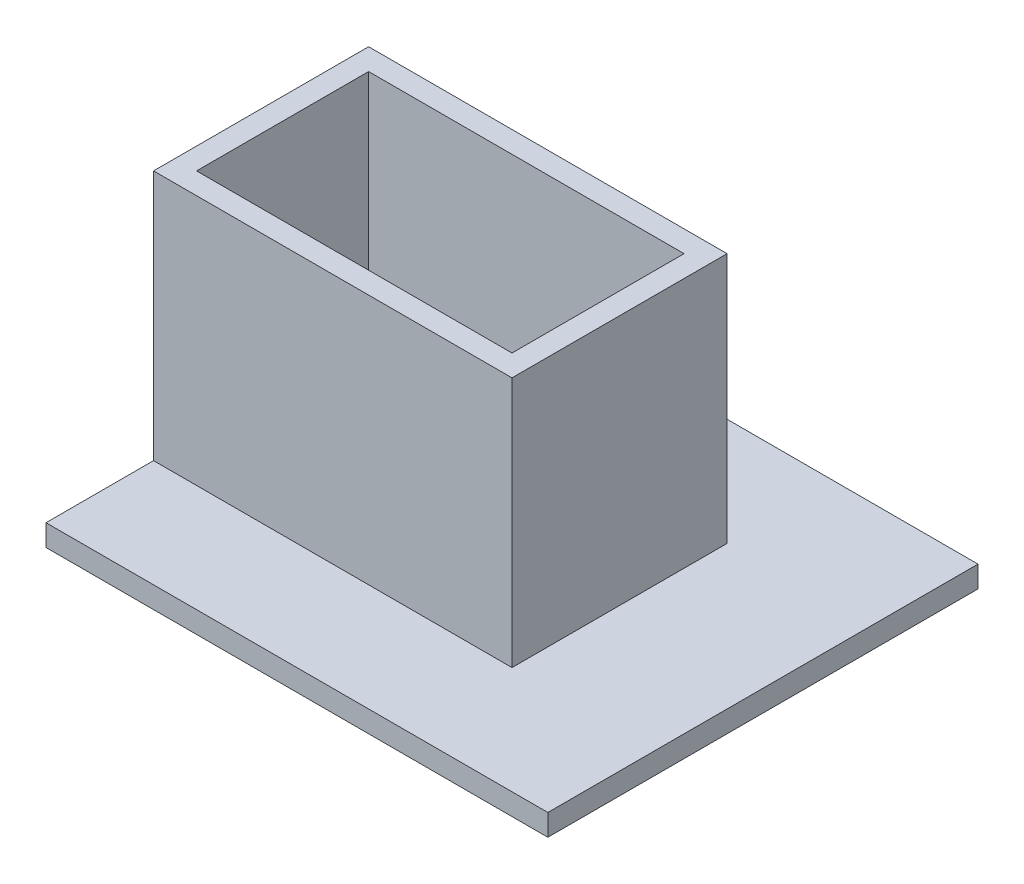
ISO-10303-21;
HEADER;
FILE_DESCRIPTION(('STEP AP214'),'2;1');
FILE_NAME('part.step','',(''),(''),'','','');
FILE_SCHEMA(('AUTOMOTIVE_DESIGN { 1 0 10303 214 1 1 1 1 }'));
ENDSEC;
DATA;
#1=APPLICATION_CONTEXT('core data for automotive mechanical design processes');
#2=APPLICATION_PROTOCOL_DEFINITION('international standard','automotive_design',2000,#1);
#3=PRODUCT_CONTEXT('',#1,'mechanical');
#4=PRODUCT('Part','Part','',(#3));
#5=PRODUCT_RELATED_PRODUCT_CATEGORY('part','',(#4));
#6=PRODUCT_DEFINITION_FORMATION('','',#4);
#7=PRODUCT_DEFINITION_CONTEXT('part definition',#1,'design');
#8=PRODUCT_DEFINITION('design','',#6,#7);
#9=PRODUCT_DEFINITION_SHAPE('','',#8);
#10=(LENGTH_UNIT() NAMED_UNIT(*) SI_UNIT(.MILLI.,.METRE.));
#11=(NAMED_UNIT(*) PLANE_ANGLE_UNIT() SI_UNIT($,.RADIAN.));
#12=(NAMED_UNIT(*) SI_UNIT($,.STERADIAN.) SOLID_ANGLE_UNIT());
#13=UNCERTAINTY_MEASURE_WITH_UNIT(LENGTH_MEASURE(1.E-05),#10,'distance_accuracy_value','');
#14=(GEOMETRIC_REPRESENTATION_CONTEXT(3) GLOBAL_UNCERTAINTY_ASSIGNED_CONTEXT((#13)) GLOBAL_UNIT_ASSIGNED_CONTEXT((#10,
#11,#12)) REPRESENTATION_CONTEXT('',''));
#15=CARTESIAN_POINT('',(0.,0.,0.));
#16=DIRECTION('',(0.,0.,1.));
#17=DIRECTION('',(1.,0.,0.));
#18=AXIS2_PLACEMENT_3D('',#15,#16,#17);
#19=CARTESIAN_POINT('',(0.,0.,0.));
#20=DIRECTION('',(0.,-1.,0.));
#21=DIRECTION('',(0.,0.,-1.));
#22=AXIS2_PLACEMENT_3D('',#19,#20,#21);
#23=PLANE('',#22);
#24=DIRECTION('',(0.,0.,1.));
#25=VECTOR('',#24,1.);
#26=CARTESIAN_POINT('',(-22.,0.,-12.));
#27=LINE('',#26,#25);
#28=CARTESIAN_POINT('',(-22.,0.,-12.));
#29=VERTEX_POINT('',#28);
#30=CARTESIAN_POINT('',(-22.,0.,12.));
#31=VERTEX_POINT('',#30);
#32=EDGE_CURVE('E140',#29,#31,#27,.T.);
#33=ORIENTED_EDGE('',*,*,#32,.T.);
#34=DIRECTION('',(1.,0.,0.));
#35=VECTOR('',#34,1.);
#36=CARTESIAN_POINT('',(-22.,0.,12.));
#37=LINE('',#36,#35);
#38=CARTESIAN_POINT('',(22.,0.,12.));
#39=VERTEX_POINT('',#38);
#40=EDGE_CURVE('E163',#31,#39,#37,.T.);
#41=ORIENTED_EDGE('',*,*,#40,.T.);
#42=DIRECTION('',(0.,0.,-1.));
#43=VECTOR('',#42,1.);
#44=CARTESIAN_POINT('',(22.,0.,12.));
#45=LINE('',#44,#43);
#46=CARTESIAN_POINT('',(22.,0.,-12.));
#47=VERTEX_POINT('',#46);
#48=EDGE_CURVE('E146',#39,#47,#45,.T.);
#49=ORIENTED_EDGE('',*,*,#48,.T.);
#50=DIRECTION('',(-1.,0.,0.));
#51=VECTOR('',#50,1.);
#52=CARTESIAN_POINT('',(22.,0.,-12.));
#53=LINE('',#52,#51);
#54=EDGE_CURVE('E168',#47,#29,#53,.T.);
#55=ORIENTED_EDGE('',*,*,#54,.T.);
#56=EDGE_LOOP('',(#33,#41,#49,#55));
#57=FACE_BOUND('',#56,.T.);
#58=ADVANCED_FACE('F39',(#57),#23,.F.);
#59=CARTESIAN_POINT('',(0.,35.,0.));
#60=DIRECTION('',(0.,1.,0.));
#61=DIRECTION('',(0.,0.,1.));
#62=AXIS2_PLACEMENT_3D('',#59,#60,#61);
#63=PLANE('',#62);
#64=DIRECTION('',(0.,0.,-1.));
#65=VECTOR('',#64,1.);
#66=CARTESIAN_POINT('',(25.,35.,15.));
#67=LINE('',#66,#65);
#68=CARTESIAN_POINT('',(25.,35.,15.));
#69=VERTEX_POINT('',#68);
#70=CARTESIAN_POINT('',(25.,35.,-15.));
#71=VERTEX_POINT('',#70);
#72=EDGE_CURVE('E182',#69,#71,#67,.T.);
#73=ORIENTED_EDGE('',*,*,#72,.T.);
#74=DIRECTION('',(-1.,0.,0.));
#75=VECTOR('',#74,1.);
#76=CARTESIAN_POINT('',(25.,35.,-15.));
#77=LINE('',#76,#75);
#78=CARTESIAN_POINT('',(-25.,35.,-15.));
#79=VERTEX_POINT('',#78);
#80=EDGE_CURVE('E186',#71,#79,#77,.T.);
#81=ORIENTED_EDGE('',*,*,#80,.T.);
#82=DIRECTION('',(0.,0.,1.));
#83=VECTOR('',#82,1.);
#84=CARTESIAN_POINT('',(-25.,35.,-15.));
#85=LINE('',#84,#83);
#86=CARTESIAN_POINT('',(-25.,35.,15.));
#87=VERTEX_POINT('',#86);
#88=EDGE_CURVE('E190',#79,#87,#85,.T.);
#89=ORIENTED_EDGE('',*,*,#88,.T.);
#90=DIRECTION('',(1.,0.,0.));
#91=VECTOR('',#90,1.);
#92=CARTESIAN_POINT('',(-25.,35.,15.));
#93=LINE('',#92,#91);
#94=EDGE_CURVE('E193',#87,#69,#93,.T.);
#95=ORIENTED_EDGE('',*,*,#94,.T.);
#96=EDGE_LOOP('',(#73,#81,#89,#95));
#97=FACE_BOUND('',#96,.T.);
#98=DIRECTION('',(0.,0.,-1.));
#99=VECTOR('',#98,1.);
#100=CARTESIAN_POINT('',(22.,35.,12.));
#101=LINE('',#100,#99);
#102=CARTESIAN_POINT('',(22.,35.,12.));
#103=VERTEX_POINT('',#102);
#104=CARTESIAN_POINT('',(22.,35.,-12.));
#105=VERTEX_POINT('',#104);
#106=EDGE_CURVE('E139',#103,#105,#101,.T.);
#107=ORIENTED_EDGE('',*,*,#106,.F.);
#108=DIRECTION('',(1.,0.,0.));
#109=VECTOR('',#108,1.);
#110=CARTESIAN_POINT('',(-22.,35.,12.));
#111=LINE('',#110,#109);
#112=CARTESIAN_POINT('',(-22.,35.,12.));
#113=VERTEX_POINT('',#112);
#114=EDGE_CURVE('E130',#113,#103,#111,.T.);
#115=ORIENTED_EDGE('',*,*,#114,.F.);
#116=DIRECTION('',(0.,0.,1.));
#117=VECTOR('',#116,1.);
#118=CARTESIAN_POINT('',(-22.,35.,-12.));
#119=LINE('',#118,#117);
#120=CARTESIAN_POINT('',(-22.,35.,-12.));
#121=VERTEX_POINT('',#120);
#122=EDGE_CURVE('E158',#121,#113,#119,.T.);
#123=ORIENTED_EDGE('',*,*,#122,.F.);
#124=DIRECTION('',(-1.,0.,0.));
#125=VECTOR('',#124,1.);
#126=CARTESIAN_POINT('',(22.,35.,-12.));
#127=LINE('',#126,#125);
#128=EDGE_CURVE('E154',#105,#121,#127,.T.);
#129=ORIENTED_EDGE('',*,*,#128,.F.);
#130=EDGE_LOOP('',(#107,#115,#123,#129));
#131=FACE_BOUND('',#130,.T.);
#132=ADVANCED_FACE('F152',(#97,#131),#63,.T.);
#133=CARTESIAN_POINT('',(25.,35.,15.));
#134=DIRECTION('',(-1.,0.,0.));
#135=DIRECTION('',(0.,0.,1.));
#136=AXIS2_PLACEMENT_3D('',#133,#134,#135);
#137=PLANE('',#136);
#138=DIRECTION('',(0.,0.,-1.));
#139=VECTOR('',#138,1.);
#140=CARTESIAN_POINT('',(25.,0.,15.));
#141=LINE('',#140,#139);
#142=CARTESIAN_POINT('',(25.,0.,15.));
#143=VERTEX_POINT('',#142);
#144=CARTESIAN_POINT('',(25.,0.,-15.));
#145=VERTEX_POINT('',#144);
#146=EDGE_CURVE('E148',#143,#145,#141,.T.);
#147=ORIENTED_EDGE('',*,*,#146,.T.);
#148=DIRECTION('',(0.,-1.,0.));
#149=VECTOR('',#148,1.);
#150=CARTESIAN_POINT('',(25.,35.,-15.));
#151=LINE('',#150,#149);
#152=EDGE_CURVE('E216',#71,#145,#151,.T.);
#153=ORIENTED_EDGE('',*,*,#152,.F.);
#154=ORIENTED_EDGE('',*,*,#72,.F.);
#155=DIRECTION('',(0.,-1.,0.));
#156=VECTOR('',#155,1.);
#157=CARTESIAN_POINT('',(25.,35.,15.));
#158=LINE('',#157,#156);
#159=EDGE_CURVE('E196',#69,#143,#158,.T.);
#160=ORIENTED_EDGE('',*,*,#159,.T.);
#161=EDGE_LOOP('',(#147,#153,#154,#160));
#162=FACE_BOUND('',#161,.T.);
#163=ADVANCED_FACE('F272',(#162),#137,.F.);
#164=CARTESIAN_POINT('',(25.,35.,-15.));
#165=DIRECTION('',(0.,0.,1.));
#166=DIRECTION('',(1.,0.,0.));
#167=AXIS2_PLACEMENT_3D('',#164,#165,#166);
#168=PLANE('',#167);
#169=DIRECTION('',(-1.,0.,0.));
#170=VECTOR('',#169,1.);
#171=CARTESIAN_POINT('',(25.,0.,-15.));
#172=LINE('',#171,#170);
#173=CARTESIAN_POINT('',(-25.,0.,-15.));
#174=VERTEX_POINT('',#173);
#175=EDGE_CURVE('E55',#145,#174,#172,.T.);
#176=ORIENTED_EDGE('',*,*,#175,.T.);
#177=DIRECTION('',(0.,-1.,0.));
#178=VECTOR('',#177,1.);
#179=CARTESIAN_POINT('',(-25.,35.,-15.));
#180=LINE('',#179,#178);
#181=EDGE_CURVE('E212',#79,#174,#180,.T.);
#182=ORIENTED_EDGE('',*,*,#181,.F.);
#183=ORIENTED_EDGE('',*,*,#80,.F.);
#184=ORIENTED_EDGE('',*,*,#152,.T.);
#185=EDGE_LOOP('',(#176,#182,#183,#184));
#186=FACE_BOUND('',#185,.T.);
#187=ADVANCED_FACE('F278',(#186),#168,.F.);
#188=CARTESIAN_POINT('',(-25.,35.,15.));
#189=DIRECTION('',(0.,0.,-1.));
#190=DIRECTION('',(-1.,0.,0.));
#191=AXIS2_PLACEMENT_3D('',#188,#189,#190);
#192=PLANE('',#191);
#193=DIRECTION('',(1.,0.,0.));
#194=VECTOR('',#193,1.);
#195=CARTESIAN_POINT('',(-25.,0.,15.));
#196=LINE('',#195,#194);
#197=CARTESIAN_POINT('',(-25.,0.,15.));
#198=VERTEX_POINT('',#197);
#199=EDGE_CURVE('E187',#198,#143,#196,.T.);
#200=ORIENTED_EDGE('',*,*,#199,.T.);
#201=ORIENTED_EDGE('',*,*,#159,.F.);
#202=ORIENTED_EDGE('',*,*,#94,.F.);
#203=DIRECTION('',(0.,-1.,0.));
#204=VECTOR('',#203,1.);
#205=CARTESIAN_POINT('',(-25.,35.,15.));
#206=LINE('',#205,#204);
#207=EDGE_CURVE('E208',#87,#198,#206,.T.);
#208=ORIENTED_EDGE('',*,*,#207,.T.);
#209=EDGE_LOOP('',(#200,#201,#202,#208));
#210=FACE_BOUND('',#209,.T.);
#211=ADVANCED_FACE('F268',(#210),#192,.F.);
#212=CARTESIAN_POINT('',(-22.,35.,12.));
#213=DIRECTION('',(0.,0.,-1.));
#214=DIRECTION('',(-1.,0.,0.));
#215=AXIS2_PLACEMENT_3D('',#212,#213,#214);
#216=PLANE('',#215);
#217=ORIENTED_EDGE('',*,*,#40,.F.);
#218=DIRECTION('',(0.,-1.,0.));
#219=VECTOR('',#218,1.);
#220=CARTESIAN_POINT('',(-22.,35.,12.));
#221=LINE('',#220,#219);
#222=EDGE_CURVE('E63',#113,#31,#221,.T.);
#223=ORIENTED_EDGE('',*,*,#222,.F.);
#224=ORIENTED_EDGE('',*,*,#114,.T.);
#225=DIRECTION('',(0.,-1.,0.));
#226=VECTOR('',#225,1.);
#227=CARTESIAN_POINT('',(22.,35.,12.));
#228=LINE('',#227,#226);
#229=EDGE_CURVE('E133',#103,#39,#228,.T.);
#230=ORIENTED_EDGE('',*,*,#229,.T.);
#231=EDGE_LOOP('',(#217,#223,#224,#230));
#232=FACE_BOUND('',#231,.T.);
#233=ADVANCED_FACE('F132',(#232),#216,.T.);
#234=CARTESIAN_POINT('',(22.,35.,12.));
#235=DIRECTION('',(-1.,0.,0.));
#236=DIRECTION('',(0.,0.,1.));
#237=AXIS2_PLACEMENT_3D('',#234,#235,#236);
#238=PLANE('',#237);
#239=ORIENTED_EDGE('',*,*,#48,.F.);
#240=ORIENTED_EDGE('',*,*,#229,.F.);
#241=ORIENTED_EDGE('',*,*,#106,.T.);
#242=DIRECTION('',(0.,-1.,0.));
#243=VECTOR('',#242,1.);
#244=CARTESIAN_POINT('',(22.,35.,-12.));
#245=LINE('',#244,#243);
#246=EDGE_CURVE('E149',#105,#47,#245,.T.);
#247=ORIENTED_EDGE('',*,*,#246,.T.);
#248=EDGE_LOOP('',(#239,#240,#241,#247));
#249=FACE_BOUND('',#248,.T.);
#250=ADVANCED_FACE('F143',(#249),#238,.T.);
#251=CARTESIAN_POINT('',(22.,35.,-12.));
#252=DIRECTION('',(0.,0.,1.));
#253=DIRECTION('',(1.,0.,0.));
#254=AXIS2_PLACEMENT_3D('',#251,#252,#253);
#255=PLANE('',#254);
#256=ORIENTED_EDGE('',*,*,#54,.F.);
#257=ORIENTED_EDGE('',*,*,#246,.F.);
#258=ORIENTED_EDGE('',*,*,#128,.T.);
#259=DIRECTION('',(0.,-1.,0.));
#260=VECTOR('',#259,1.);
#261=CARTESIAN_POINT('',(-22.,35.,-12.));
#262=LINE('',#261,#260);
#263=EDGE_CURVE('E177',#121,#29,#262,.T.);
#264=ORIENTED_EDGE('',*,*,#263,.T.);
#265=EDGE_LOOP('',(#256,#257,#258,#264));
#266=FACE_BOUND('',#265,.T.);
#267=ADVANCED_FACE('F325',(#266),#255,.T.);
#268=CARTESIAN_POINT('',(-22.,35.,-12.));
#269=DIRECTION('',(1.,0.,0.));
#270=DIRECTION('',(0.,0.,-1.));
#271=AXIS2_PLACEMENT_3D('',#268,#269,#270);
#272=PLANE('',#271);
#273=ORIENTED_EDGE('',*,*,#32,.F.);
#274=ORIENTED_EDGE('',*,*,#263,.F.);
#275=ORIENTED_EDGE('',*,*,#122,.T.);
#276=ORIENTED_EDGE('',*,*,#222,.T.);
#277=EDGE_LOOP('',(#273,#274,#275,#276));
#278=FACE_BOUND('',#277,.T.);
#279=ADVANCED_FACE('F314',(#278),#272,.T.);
#280=CARTESIAN_POINT('',(0.,-3.,0.));
#281=DIRECTION('',(0.,-1.,0.));
#282=DIRECTION('',(0.,0.,-1.));
#283=AXIS2_PLACEMENT_3D('',#280,#281,#282);
#284=PLANE('',#283);
#285=DIRECTION('',(0.,0.,1.));
#286=VECTOR('',#285,1.);
#287=CARTESIAN_POINT('',(45.,-3.,30.));
#288=LINE('',#287,#286);
#289=CARTESIAN_POINT('',(45.,-3.,-30.));
#290=VERTEX_POINT('',#289);
#291=CARTESIAN_POINT('',(45.,-3.,30.));
#292=VERTEX_POINT('',#291);
#293=EDGE_CURVE('E220',#290,#292,#288,.T.);
#294=ORIENTED_EDGE('',*,*,#293,.T.);
#295=DIRECTION('',(-1.,0.,0.));
#296=VECTOR('',#295,1.);
#297=CARTESIAN_POINT('',(-25.,-3.,30.));
#298=LINE('',#297,#296);
#299=CARTESIAN_POINT('',(-25.,-3.,30.));
#300=VERTEX_POINT('',#299);
#301=EDGE_CURVE('E224',#292,#300,#298,.T.);
#302=ORIENTED_EDGE('',*,*,#301,.T.);
#303=DIRECTION('',(0.,0.,-1.));
#304=VECTOR('',#303,1.);
#305=CARTESIAN_POINT('',(-25.,-3.,30.));
#306=LINE('',#305,#304);
#307=CARTESIAN_POINT('',(-25.,-3.,-30.));
#308=VERTEX_POINT('',#307);
#309=EDGE_CURVE('E228',#300,#308,#306,.T.);
#310=ORIENTED_EDGE('',*,*,#309,.T.);
#311=DIRECTION('',(1.,0.,0.));
#312=VECTOR('',#311,1.);
#313=CARTESIAN_POINT('',(-25.,-3.,-30.));
#314=LINE('',#313,#312);
#315=EDGE_CURVE('E231',#308,#290,#314,.T.);
#316=ORIENTED_EDGE('',*,*,#315,.T.);
#317=EDGE_LOOP('',(#294,#302,#310,#316));
#318=FACE_BOUND('',#317,.T.);
#319=ADVANCED_FACE('F309',(#318),#284,.T.);
#320=CARTESIAN_POINT('',(-25.,-3.,-30.));
#321=DIRECTION('',(0.,0.,1.));
#322=DIRECTION('',(1.,0.,0.));
#323=AXIS2_PLACEMENT_3D('',#320,#321,#322);
#324=PLANE('',#323);
#325=DIRECTION('',(1.,0.,0.));
#326=VECTOR('',#325,1.);
#327=CARTESIAN_POINT('',(-25.,0.,-30.));
#328=LINE('',#327,#326);
#329=CARTESIAN_POINT('',(-25.,0.,-30.));
#330=VERTEX_POINT('',#329);
#331=CARTESIAN_POINT('',(45.,0.,-30.));
#332=VERTEX_POINT('',#331);
#333=EDGE_CURVE('E225',#330,#332,#328,.T.);
#334=ORIENTED_EDGE('',*,*,#333,.T.);
#335=DIRECTION('',(0.,1.,0.));
#336=VECTOR('',#335,1.);
#337=CARTESIAN_POINT('',(45.,-3.,-30.));
#338=LINE('',#337,#336);
#339=EDGE_CURVE('E234',#290,#332,#338,.T.);
#340=ORIENTED_EDGE('',*,*,#339,.F.);
#341=ORIENTED_EDGE('',*,*,#315,.F.);
#342=DIRECTION('',(0.,1.,0.));
#343=VECTOR('',#342,1.);
#344=CARTESIAN_POINT('',(-25.,-3.,-30.));
#345=LINE('',#344,#343);
#346=EDGE_CURVE('E251',#308,#330,#345,.T.);
#347=ORIENTED_EDGE('',*,*,#346,.T.);
#348=EDGE_LOOP('',(#334,#340,#341,#347));
#349=FACE_BOUND('',#348,.T.);
#350=ADVANCED_FACE('F306',(#349),#324,.F.);
#351=CARTESIAN_POINT('',(45.,-3.,30.));
#352=DIRECTION('',(-1.,0.,0.));
#353=DIRECTION('',(0.,0.,1.));
#354=AXIS2_PLACEMENT_3D('',#351,#352,#353);
#355=PLANE('',#354);
#356=DIRECTION('',(0.,0.,1.));
#357=VECTOR('',#356,1.);
#358=CARTESIAN_POINT('',(45.,0.,30.));
#359=LINE('',#358,#357);
#360=CARTESIAN_POINT('',(45.,0.,30.));
#361=VERTEX_POINT('',#360);
#362=EDGE_CURVE('E219',#332,#361,#359,.T.);
#363=ORIENTED_EDGE('',*,*,#362,.T.);
#364=DIRECTION('',(0.,1.,0.));
#365=VECTOR('',#364,1.);
#366=CARTESIAN_POINT('',(45.,-3.,30.));
#367=LINE('',#366,#365);
#368=EDGE_CURVE('E11',#292,#361,#367,.T.);
#369=ORIENTED_EDGE('',*,*,#368,.F.);
#370=ORIENTED_EDGE('',*,*,#293,.F.);
#371=ORIENTED_EDGE('',*,*,#339,.T.);
#372=EDGE_LOOP('',(#363,#369,#370,#371));
#373=FACE_BOUND('',#372,.T.);
#374=ADVANCED_FACE('F41',(#373),#355,.F.);
#375=CARTESIAN_POINT('',(-25.,-3.,30.));
#376=DIRECTION('',(0.,0.,-1.));
#377=DIRECTION('',(-1.,0.,0.));
#378=AXIS2_PLACEMENT_3D('',#375,#376,#377);
#379=PLANE('',#378);
#380=DIRECTION('',(-1.,0.,0.));
#381=VECTOR('',#380,1.);
#382=CARTESIAN_POINT('',(-25.,0.,30.));
#383=LINE('',#382,#381);
#384=CARTESIAN_POINT('',(-25.,0.,30.));
#385=VERTEX_POINT('',#384);
#386=EDGE_CURVE('E238',#361,#385,#383,.T.);
#387=ORIENTED_EDGE('',*,*,#386,.T.);
#388=DIRECTION('',(0.,1.,0.));
#389=VECTOR('',#388,1.);
#390=CARTESIAN_POINT('',(-25.,-3.,30.));
#391=LINE('',#390,#389);
#392=EDGE_CURVE('E48',#300,#385,#391,.T.);
#393=ORIENTED_EDGE('',*,*,#392,.F.);
#394=ORIENTED_EDGE('',*,*,#301,.F.);
#395=ORIENTED_EDGE('',*,*,#368,.T.);
#396=EDGE_LOOP('',(#387,#393,#394,#395));
#397=FACE_BOUND('',#396,.T.);
#398=ADVANCED_FACE('F297',(#397),#379,.F.);
#399=ORIENTED_EDGE('',*,*,#175,.F.);
#400=ORIENTED_EDGE('',*,*,#146,.F.);
#401=ORIENTED_EDGE('',*,*,#199,.F.);
#402=DIRECTION('',(0.,0.,-1.));
#403=VECTOR('',#402,1.);
#404=CARTESIAN_POINT('',(-25.,0.,30.));
#405=LINE('',#404,#403);
#406=EDGE_CURVE('E242',#385,#198,#405,.T.);
#407=ORIENTED_EDGE('',*,*,#406,.F.);
#408=ORIENTED_EDGE('',*,*,#386,.F.);
#409=ORIENTED_EDGE('',*,*,#362,.F.);
#410=ORIENTED_EDGE('',*,*,#333,.F.);
#411=EDGE_CURVE('E241',#174,#330,#405,.T.);
#412=ORIENTED_EDGE('',*,*,#411,.F.);
#413=EDGE_LOOP('',(#399,#400,#401,#407,#408,#409,#410,#412));
#414=FACE_BOUND('',#413,.T.);
#415=ADVANCED_FACE('F264',(#414),#23,.F.);
#416=CARTESIAN_POINT('',(-25.,-3.,30.));
#417=DIRECTION('',(1.,0.,0.));
#418=DIRECTION('',(0.,0.,-1.));
#419=AXIS2_PLACEMENT_3D('',#416,#417,#418);
#420=PLANE('',#419);
#421=ORIENTED_EDGE('',*,*,#406,.T.);
#422=ORIENTED_EDGE('',*,*,#207,.F.);
#423=ORIENTED_EDGE('',*,*,#88,.F.);
#424=ORIENTED_EDGE('',*,*,#181,.T.);
#425=ORIENTED_EDGE('',*,*,#411,.T.);
#426=ORIENTED_EDGE('',*,*,#346,.F.);
#427=ORIENTED_EDGE('',*,*,#309,.F.);
#428=ORIENTED_EDGE('',*,*,#392,.T.);
#429=EDGE_LOOP('',(#421,#422,#423,#424,#425,#426,#427,#428));
#430=FACE_BOUND('',#429,.T.);
#431=ADVANCED_FACE('F260',(#430),#420,.F.);
#432=CLOSED_SHELL('',(#58,#132,#163,#187,#211,#233,#250,#267,#279,#319,#350,#374,#398,#415,#431));
#433=MANIFOLD_SOLID_BREP('B2',#432);
#434=ADVANCED_BREP_SHAPE_REPRESENTATION('',(#18,#433),#14);
#435=SHAPE_DEFINITION_REPRESENTATION(#9,#434);
ENDSEC;
END-ISO-10303-21;
